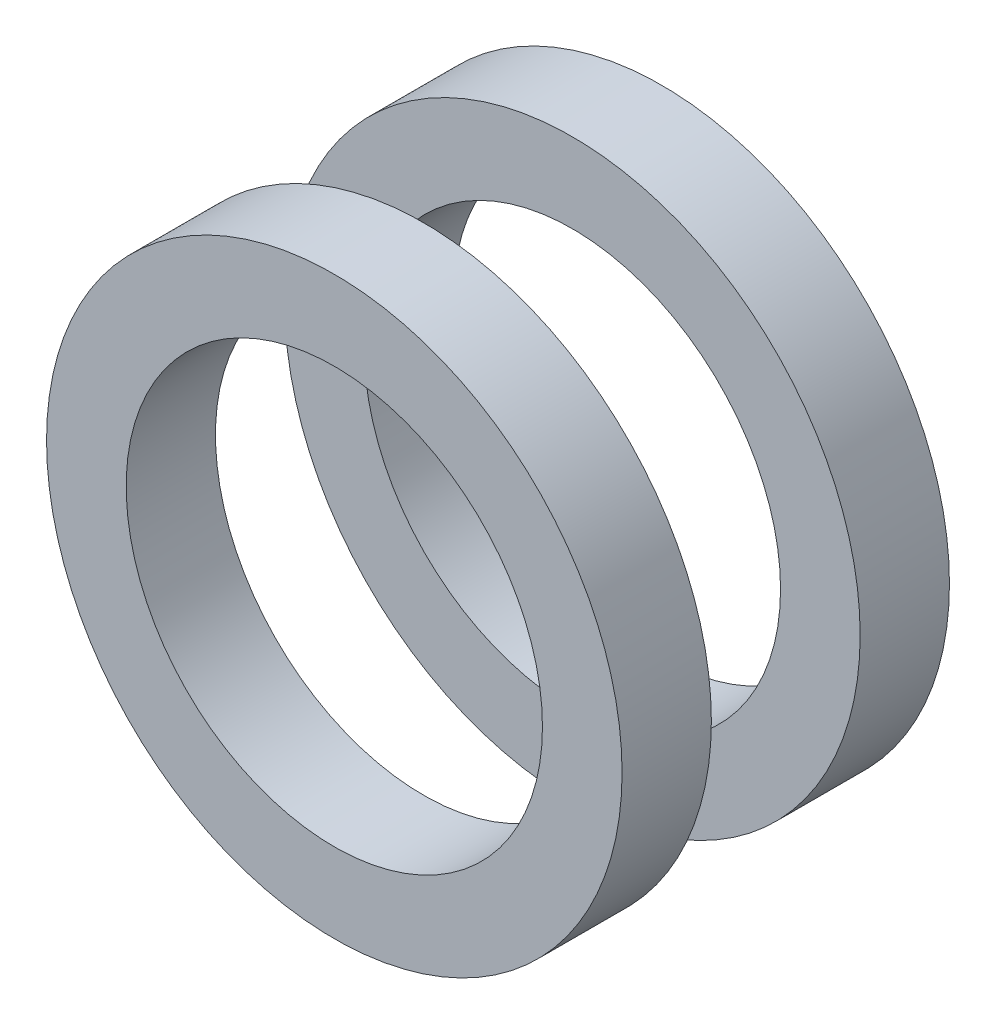
ISO-10303-21;
HEADER;
FILE_DESCRIPTION(('STEP AP214'),'2;1');
FILE_NAME('part.step','',(''),(''),'','','');
FILE_SCHEMA(('AUTOMOTIVE_DESIGN { 1 0 10303 214 1 1 1 1 }'));
ENDSEC;
DATA;
#1=APPLICATION_CONTEXT('core data for automotive mechanical design processes');
#2=APPLICATION_PROTOCOL_DEFINITION('international standard','automotive_design',2000,#1);
#3=PRODUCT_CONTEXT('',#1,'mechanical');
#4=PRODUCT('Part','Part','',(#3));
#5=PRODUCT_RELATED_PRODUCT_CATEGORY('part','',(#4));
#6=PRODUCT_DEFINITION_FORMATION('','',#4);
#7=PRODUCT_DEFINITION_CONTEXT('part definition',#1,'design');
#8=PRODUCT_DEFINITION('design','',#6,#7);
#9=PRODUCT_DEFINITION_SHAPE('','',#8);
#10=(LENGTH_UNIT() NAMED_UNIT(*) SI_UNIT(.MILLI.,.METRE.));
#11=(NAMED_UNIT(*) PLANE_ANGLE_UNIT() SI_UNIT($,.RADIAN.));
#12=(NAMED_UNIT(*) SI_UNIT($,.STERADIAN.) SOLID_ANGLE_UNIT());
#13=UNCERTAINTY_MEASURE_WITH_UNIT(LENGTH_MEASURE(1.E-05),#10,'distance_accuracy_value','');
#14=(GEOMETRIC_REPRESENTATION_CONTEXT(3) GLOBAL_UNCERTAINTY_ASSIGNED_CONTEXT((#13)) GLOBAL_UNIT_ASSIGNED_CONTEXT((#10,
#11,#12)) REPRESENTATION_CONTEXT('',''));
#15=CARTESIAN_POINT('',(0.,0.,0.));
#16=DIRECTION('',(0.,0.,1.));
#17=DIRECTION('',(1.,0.,0.));
#18=AXIS2_PLACEMENT_3D('',#15,#16,#17);
#19=CARTESIAN_POINT('',(0.,0.,-15.));
#20=DIRECTION('',(0.,0.,1.));
#21=DIRECTION('',(1.,0.,0.));
#22=AXIS2_PLACEMENT_3D('',#19,#20,#21);
#23=PLANE('',#22);
#24=CARTESIAN_POINT('',(0.,0.,-15.));
#25=DIRECTION('',(0.,0.,1.));
#26=DIRECTION('',(1.,0.,0.));
#27=AXIS2_PLACEMENT_3D('',#24,#25,#26);
#28=CIRCLE('',#27,58.0153846153846);
#29=CARTESIAN_POINT('',(58.0153846153846,0.,-15.));
#30=VERTEX_POINT('',#29);
#31=EDGE_CURVE('E11',#30,#30,#28,.T.);
#32=ORIENTED_EDGE('',*,*,#31,.T.);
#33=EDGE_LOOP('',(#32));
#34=FACE_BOUND('',#33,.T.);
#35=CARTESIAN_POINT('',(0.,0.,-15.));
#36=DIRECTION('',(0.,0.,1.));
#37=DIRECTION('',(1.,0.,0.));
#38=AXIS2_PLACEMENT_3D('',#35,#36,#37);
#39=CIRCLE('',#38,41.9615384615385);
#40=CARTESIAN_POINT('',(41.9615384615385,0.,-15.));
#41=VERTEX_POINT('',#40);
#42=EDGE_CURVE('E54',#41,#41,#39,.T.);
#43=ORIENTED_EDGE('',*,*,#42,.F.);
#44=EDGE_LOOP('',(#43));
#45=FACE_BOUND('',#44,.T.);
#46=ADVANCED_FACE('F43',(#34,#45),#23,.T.);
#47=CARTESIAN_POINT('',(0.,0.,-33.));
#48=DIRECTION('',(0.,0.,1.));
#49=DIRECTION('',(1.,0.,0.));
#50=AXIS2_PLACEMENT_3D('',#47,#48,#49);
#51=PLANE('',#50);
#52=CARTESIAN_POINT('',(0.,0.,-33.));
#53=DIRECTION('',(0.,0.,1.));
#54=DIRECTION('',(1.,0.,0.));
#55=AXIS2_PLACEMENT_3D('',#52,#53,#54);
#56=CIRCLE('',#55,58.0153846153846);
#57=CARTESIAN_POINT('',(58.0153846153846,0.,-33.));
#58=VERTEX_POINT('',#57);
#59=EDGE_CURVE('E47',#58,#58,#56,.T.);
#60=ORIENTED_EDGE('',*,*,#59,.F.);
#61=EDGE_LOOP('',(#60));
#62=FACE_BOUND('',#61,.T.);
#63=CARTESIAN_POINT('',(0.,0.,-33.));
#64=DIRECTION('',(0.,0.,1.));
#65=DIRECTION('',(1.,0.,0.));
#66=AXIS2_PLACEMENT_3D('',#63,#64,#65);
#67=CIRCLE('',#66,41.9615384615385);
#68=CARTESIAN_POINT('',(41.9615384615385,0.,-33.));
#69=VERTEX_POINT('',#68);
#70=EDGE_CURVE('E56',#69,#69,#67,.T.);
#71=ORIENTED_EDGE('',*,*,#70,.T.);
#72=EDGE_LOOP('',(#71));
#73=FACE_BOUND('',#72,.T.);
#74=ADVANCED_FACE('F66',(#62,#73),#51,.F.);
#75=CARTESIAN_POINT('',(0.,0.,-15.));
#76=DIRECTION('',(0.,0.,-1.));
#77=DIRECTION('',(-1.,0.,0.));
#78=AXIS2_PLACEMENT_3D('',#75,#76,#77);
#79=CYLINDRICAL_SURFACE('',#78,58.0153846153846);
#80=ORIENTED_EDGE('',*,*,#31,.F.);
#81=EDGE_LOOP('',(#80));
#82=FACE_BOUND('',#81,.T.);
#83=ORIENTED_EDGE('',*,*,#59,.T.);
#84=EDGE_LOOP('',(#83));
#85=FACE_BOUND('',#84,.T.);
#86=ADVANCED_FACE('F45',(#82,#85),#79,.T.);
#87=CARTESIAN_POINT('',(0.,0.,-15.));
#88=DIRECTION('',(0.,0.,-1.));
#89=DIRECTION('',(-1.,0.,0.));
#90=AXIS2_PLACEMENT_3D('',#87,#88,#89);
#91=CYLINDRICAL_SURFACE('',#90,41.9615384615385);
#92=ORIENTED_EDGE('',*,*,#42,.T.);
#93=EDGE_LOOP('',(#92));
#94=FACE_BOUND('',#93,.T.);
#95=ORIENTED_EDGE('',*,*,#70,.F.);
#96=EDGE_LOOP('',(#95));
#97=FACE_BOUND('',#96,.T.);
#98=ADVANCED_FACE('F62',(#94,#97),#91,.F.);
#99=CLOSED_SHELL('',(#46,#74,#86,#98));
#100=MANIFOLD_SOLID_BREP('B2',#99);
#101=CARTESIAN_POINT('',(0.,0.,33.));
#102=DIRECTION('',(0.,0.,1.));
#103=DIRECTION('',(1.,0.,0.));
#104=AXIS2_PLACEMENT_3D('',#101,#102,#103);
#105=PLANE('',#104);
#106=CARTESIAN_POINT('',(0.,0.,33.));
#107=DIRECTION('',(0.,0.,1.));
#108=DIRECTION('',(1.,0.,0.));
#109=AXIS2_PLACEMENT_3D('',#106,#107,#108);
#110=CIRCLE('',#109,58.0153846153846);
#111=CARTESIAN_POINT('',(58.0153846153846,0.,33.));
#112=VERTEX_POINT('',#111);
#113=EDGE_CURVE('E42',#112,#112,#110,.T.);
#114=ORIENTED_EDGE('',*,*,#113,.T.);
#115=EDGE_LOOP('',(#114));
#116=FACE_BOUND('',#115,.T.);
#117=CARTESIAN_POINT('',(0.,0.,33.));
#118=DIRECTION('',(0.,0.,1.));
#119=DIRECTION('',(1.,0.,0.));
#120=AXIS2_PLACEMENT_3D('',#117,#118,#119);
#121=CIRCLE('',#120,41.9615384615385);
#122=CARTESIAN_POINT('',(41.9615384615385,0.,33.));
#123=VERTEX_POINT('',#122);
#124=EDGE_CURVE('E116',#123,#123,#121,.T.);
#125=ORIENTED_EDGE('',*,*,#124,.F.);
#126=EDGE_LOOP('',(#125));
#127=FACE_BOUND('',#126,.T.);
#128=ADVANCED_FACE('F105',(#116,#127),#105,.T.);
#129=CARTESIAN_POINT('',(0.,0.,15.));
#130=DIRECTION('',(0.,0.,1.));
#131=DIRECTION('',(1.,0.,0.));
#132=AXIS2_PLACEMENT_3D('',#129,#130,#131);
#133=PLANE('',#132);
#134=CARTESIAN_POINT('',(0.,0.,15.));
#135=DIRECTION('',(0.,0.,1.));
#136=DIRECTION('',(1.,0.,0.));
#137=AXIS2_PLACEMENT_3D('',#134,#135,#136);
#138=CIRCLE('',#137,58.0153846153846);
#139=CARTESIAN_POINT('',(58.0153846153846,0.,15.));
#140=VERTEX_POINT('',#139);
#141=EDGE_CURVE('E109',#140,#140,#138,.T.);
#142=ORIENTED_EDGE('',*,*,#141,.F.);
#143=EDGE_LOOP('',(#142));
#144=FACE_BOUND('',#143,.T.);
#145=CARTESIAN_POINT('',(0.,0.,15.));
#146=DIRECTION('',(0.,0.,1.));
#147=DIRECTION('',(1.,0.,0.));
#148=AXIS2_PLACEMENT_3D('',#145,#146,#147);
#149=CIRCLE('',#148,41.9615384615385);
#150=CARTESIAN_POINT('',(41.9615384615385,0.,15.));
#151=VERTEX_POINT('',#150);
#152=EDGE_CURVE('E118',#151,#151,#149,.T.);
#153=ORIENTED_EDGE('',*,*,#152,.T.);
#154=EDGE_LOOP('',(#153));
#155=FACE_BOUND('',#154,.T.);
#156=ADVANCED_FACE('F128',(#144,#155),#133,.F.);
#157=CARTESIAN_POINT('',(0.,0.,33.));
#158=DIRECTION('',(0.,0.,-1.));
#159=DIRECTION('',(-1.,0.,0.));
#160=AXIS2_PLACEMENT_3D('',#157,#158,#159);
#161=CYLINDRICAL_SURFACE('',#160,58.0153846153846);
#162=ORIENTED_EDGE('',*,*,#113,.F.);
#163=EDGE_LOOP('',(#162));
#164=FACE_BOUND('',#163,.T.);
#165=ORIENTED_EDGE('',*,*,#141,.T.);
#166=EDGE_LOOP('',(#165));
#167=FACE_BOUND('',#166,.T.);
#168=ADVANCED_FACE('F107',(#164,#167),#161,.T.);
#169=CARTESIAN_POINT('',(0.,0.,33.));
#170=DIRECTION('',(0.,0.,-1.));
#171=DIRECTION('',(-1.,0.,0.));
#172=AXIS2_PLACEMENT_3D('',#169,#170,#171);
#173=CYLINDRICAL_SURFACE('',#172,41.9615384615385);
#174=ORIENTED_EDGE('',*,*,#124,.T.);
#175=EDGE_LOOP('',(#174));
#176=FACE_BOUND('',#175,.T.);
#177=ORIENTED_EDGE('',*,*,#152,.F.);
#178=EDGE_LOOP('',(#177));
#179=FACE_BOUND('',#178,.T.);
#180=ADVANCED_FACE('F124',(#176,#179),#173,.F.);
#181=CLOSED_SHELL('',(#128,#156,#168,#180));
#182=MANIFOLD_SOLID_BREP('B6',#181);
#183=ADVANCED_BREP_SHAPE_REPRESENTATION('',(#18,#100,#182),#14);
#184=SHAPE_DEFINITION_REPRESENTATION(#9,#183);
ENDSEC;
END-ISO-10303-21;
